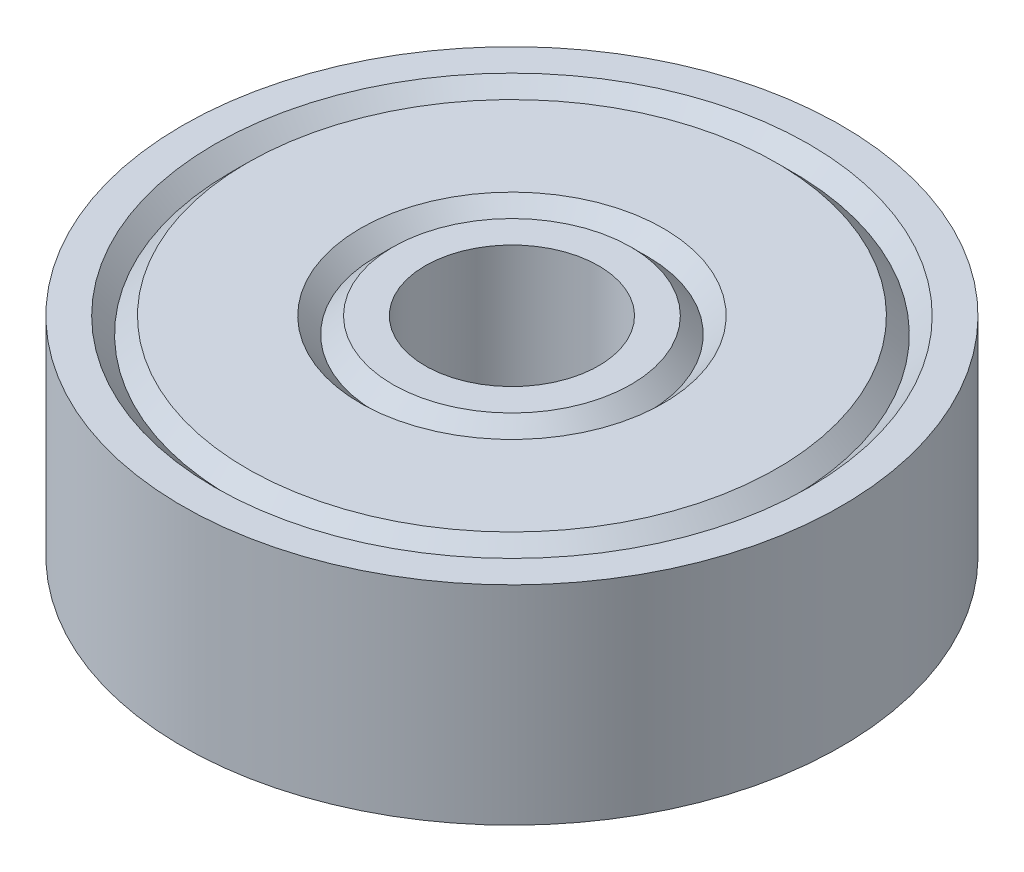
ISO-10303-21;
HEADER;
FILE_DESCRIPTION(('STEP AP214'),'2;1');
FILE_NAME('part.step','',(''),(''),'','','');
FILE_SCHEMA(('AUTOMOTIVE_DESIGN { 1 0 10303 214 1 1 1 1 }'));
ENDSEC;
DATA;
#1=APPLICATION_CONTEXT('core data for automotive mechanical design processes');
#2=APPLICATION_PROTOCOL_DEFINITION('international standard','automotive_design',2000,#1);
#3=PRODUCT_CONTEXT('',#1,'mechanical');
#4=PRODUCT('Part','Part','',(#3));
#5=PRODUCT_RELATED_PRODUCT_CATEGORY('part','',(#4));
#6=PRODUCT_DEFINITION_FORMATION('','',#4);
#7=PRODUCT_DEFINITION_CONTEXT('part definition',#1,'design');
#8=PRODUCT_DEFINITION('design','',#6,#7);
#9=PRODUCT_DEFINITION_SHAPE('','',#8);
#10=(LENGTH_UNIT() NAMED_UNIT(*) SI_UNIT(.MILLI.,.METRE.));
#11=(NAMED_UNIT(*) PLANE_ANGLE_UNIT() SI_UNIT($,.RADIAN.));
#12=(NAMED_UNIT(*) SI_UNIT($,.STERADIAN.) SOLID_ANGLE_UNIT());
#13=UNCERTAINTY_MEASURE_WITH_UNIT(LENGTH_MEASURE(1.E-05),#10,'distance_accuracy_value','');
#14=(GEOMETRIC_REPRESENTATION_CONTEXT(3) GLOBAL_UNCERTAINTY_ASSIGNED_CONTEXT((#13)) GLOBAL_UNIT_ASSIGNED_CONTEXT((#10,
#11,#12)) REPRESENTATION_CONTEXT('',''));
#15=CARTESIAN_POINT('',(0.,0.,0.));
#16=DIRECTION('',(0.,0.,1.));
#17=DIRECTION('',(1.,0.,0.));
#18=AXIS2_PLACEMENT_3D('',#15,#16,#17);
#19=CARTESIAN_POINT('',(0.,3.,0.));
#20=DIRECTION('',(0.,1.,0.));
#21=DIRECTION('',(-1.,0.,0.));
#22=AXIS2_PLACEMENT_3D('',#19,#20,#21);
#23=CYLINDRICAL_SURFACE('',#22,2.5);
#24=CARTESIAN_POINT('',(0.,3.,0.));
#25=DIRECTION('',(0.,1.,0.));
#26=DIRECTION('',(-1.,0.,0.));
#27=AXIS2_PLACEMENT_3D('',#24,#25,#26);
#28=CIRCLE('',#27,2.5);
#29=CARTESIAN_POINT('',(-2.5,3.,0.));
#30=VERTEX_POINT('',#29);
#31=EDGE_CURVE('E83',#30,#30,#28,.T.);
#32=ORIENTED_EDGE('',*,*,#31,.T.);
#33=EDGE_LOOP('',(#32));
#34=FACE_BOUND('',#33,.T.);
#35=CARTESIAN_POINT('',(0.,-3.,0.));
#36=DIRECTION('',(0.,1.,0.));
#37=DIRECTION('',(-1.,0.,0.));
#38=AXIS2_PLACEMENT_3D('',#35,#36,#37);
#39=CIRCLE('',#38,2.5);
#40=CARTESIAN_POINT('',(-2.5,-3.,0.));
#41=VERTEX_POINT('',#40);
#42=EDGE_CURVE('E10',#41,#41,#39,.T.);
#43=ORIENTED_EDGE('',*,*,#42,.F.);
#44=EDGE_LOOP('',(#43));
#45=FACE_BOUND('',#44,.T.);
#46=ADVANCED_FACE('F31',(#34,#45),#23,.F.);
#47=CARTESIAN_POINT('',(-2.5,-3.,0.));
#48=DIRECTION('',(0.,-1.,0.));
#49=DIRECTION('',(1.,0.,0.));
#50=AXIS2_PLACEMENT_3D('',#47,#48,#49);
#51=PLANE('',#50);
#52=ORIENTED_EDGE('',*,*,#42,.T.);
#53=EDGE_LOOP('',(#52));
#54=FACE_BOUND('',#53,.T.);
#55=CARTESIAN_POINT('',(0.,-3.,0.));
#56=DIRECTION('',(0.,1.,0.));
#57=DIRECTION('',(-1.,0.,0.));
#58=AXIS2_PLACEMENT_3D('',#55,#56,#57);
#59=CIRCLE('',#58,3.43333333333333);
#60=CARTESIAN_POINT('',(-3.43333333333333,-3.,0.));
#61=VERTEX_POINT('',#60);
#62=EDGE_CURVE('E37',#61,#61,#59,.T.);
#63=ORIENTED_EDGE('',*,*,#62,.F.);
#64=EDGE_LOOP('',(#63));
#65=FACE_BOUND('',#64,.T.);
#66=ADVANCED_FACE('F101',(#54,#65),#51,.T.);
#67=CARTESIAN_POINT('',(0.,-2.53333333333334,0.));
#68=DIRECTION('',(0.,1.,0.));
#69=DIRECTION('',(-1.,0.,0.));
#70=AXIS2_PLACEMENT_3D('',#67,#68,#69);
#71=CONICAL_SURFACE('',#70,3.89999999999999,0.785398163397451);
#72=ORIENTED_EDGE('',*,*,#62,.T.);
#73=EDGE_LOOP('',(#72));
#74=FACE_BOUND('',#73,.T.);
#75=CARTESIAN_POINT('',(0.,-2.53333333333334,0.));
#76=DIRECTION('',(0.,1.,0.));
#77=DIRECTION('',(-1.,0.,0.));
#78=AXIS2_PLACEMENT_3D('',#75,#76,#77);
#79=CIRCLE('',#78,3.89999999999999);
#80=CARTESIAN_POINT('',(-3.89999999999999,-2.53333333333334,0.));
#81=VERTEX_POINT('',#80);
#82=EDGE_CURVE('E41',#81,#81,#79,.T.);
#83=ORIENTED_EDGE('',*,*,#82,.F.);
#84=EDGE_LOOP('',(#83));
#85=FACE_BOUND('',#84,.T.);
#86=ADVANCED_FACE('F105',(#74,#85),#71,.T.);
#87=CARTESIAN_POINT('',(0.,-3.,0.));
#88=DIRECTION('',(0.,-1.,0.));
#89=DIRECTION('',(1.,0.,0.));
#90=AXIS2_PLACEMENT_3D('',#87,#88,#89);
#91=CONICAL_SURFACE('',#90,4.36666666666666,0.785398163397448);
#92=ORIENTED_EDGE('',*,*,#82,.T.);
#93=EDGE_LOOP('',(#92));
#94=FACE_BOUND('',#93,.T.);
#95=CARTESIAN_POINT('',(0.,-3.,0.));
#96=DIRECTION('',(0.,1.,0.));
#97=DIRECTION('',(-1.,0.,0.));
#98=AXIS2_PLACEMENT_3D('',#95,#96,#97);
#99=CIRCLE('',#98,4.36666666666666);
#100=CARTESIAN_POINT('',(-4.36666666666666,-3.,0.));
#101=VERTEX_POINT('',#100);
#102=EDGE_CURVE('E45',#101,#101,#99,.T.);
#103=ORIENTED_EDGE('',*,*,#102,.F.);
#104=EDGE_LOOP('',(#103));
#105=FACE_BOUND('',#104,.T.);
#106=ADVANCED_FACE('F109',(#94,#105),#91,.F.);
#107=CARTESIAN_POINT('',(-4.36666666666666,-3.,0.));
#108=DIRECTION('',(0.,-1.,0.));
#109=DIRECTION('',(1.,0.,0.));
#110=AXIS2_PLACEMENT_3D('',#107,#108,#109);
#111=PLANE('',#110);
#112=ORIENTED_EDGE('',*,*,#102,.T.);
#113=EDGE_LOOP('',(#112));
#114=FACE_BOUND('',#113,.T.);
#115=CARTESIAN_POINT('',(0.,-3.00000000000001,0.));
#116=DIRECTION('',(0.,1.,0.));
#117=DIRECTION('',(-1.,0.,0.));
#118=AXIS2_PLACEMENT_3D('',#115,#116,#117);
#119=CIRCLE('',#118,7.63333333333333);
#120=CARTESIAN_POINT('',(-7.63333333333333,-3.00000000000001,0.));
#121=VERTEX_POINT('',#120);
#122=EDGE_CURVE('E50',#121,#121,#119,.T.);
#123=ORIENTED_EDGE('',*,*,#122,.F.);
#124=EDGE_LOOP('',(#123));
#125=FACE_BOUND('',#124,.T.);
#126=ADVANCED_FACE('F115',(#114,#125),#111,.T.);
#127=CARTESIAN_POINT('',(0.,-2.53333333333334,0.));
#128=DIRECTION('',(0.,1.,0.));
#129=DIRECTION('',(-1.,0.,0.));
#130=AXIS2_PLACEMENT_3D('',#127,#128,#129);
#131=CONICAL_SURFACE('',#130,8.1,0.785398163397448);
#132=ORIENTED_EDGE('',*,*,#122,.T.);
#133=EDGE_LOOP('',(#132));
#134=FACE_BOUND('',#133,.T.);
#135=CARTESIAN_POINT('',(0.,-2.53333333333334,0.));
#136=DIRECTION('',(0.,1.,0.));
#137=DIRECTION('',(-1.,0.,0.));
#138=AXIS2_PLACEMENT_3D('',#135,#136,#137);
#139=CIRCLE('',#138,8.1);
#140=CARTESIAN_POINT('',(-8.1,-2.53333333333333,0.));
#141=VERTEX_POINT('',#140);
#142=EDGE_CURVE('E53',#141,#141,#139,.T.);
#143=ORIENTED_EDGE('',*,*,#142,.F.);
#144=EDGE_LOOP('',(#143));
#145=FACE_BOUND('',#144,.T.);
#146=ADVANCED_FACE('F119',(#134,#145),#131,.T.);
#147=CARTESIAN_POINT('',(0.,-3.,0.));
#148=DIRECTION('',(0.,-1.,0.));
#149=DIRECTION('',(1.,0.,0.));
#150=AXIS2_PLACEMENT_3D('',#147,#148,#149);
#151=CONICAL_SURFACE('',#150,8.56666666666666,0.785398163397447);
#152=ORIENTED_EDGE('',*,*,#142,.T.);
#153=EDGE_LOOP('',(#152));
#154=FACE_BOUND('',#153,.T.);
#155=CARTESIAN_POINT('',(0.,-3.,0.));
#156=DIRECTION('',(0.,1.,0.));
#157=DIRECTION('',(-1.,0.,0.));
#158=AXIS2_PLACEMENT_3D('',#155,#156,#157);
#159=CIRCLE('',#158,8.56666666666666);
#160=CARTESIAN_POINT('',(-8.56666666666666,-3.,0.));
#161=VERTEX_POINT('',#160);
#162=EDGE_CURVE('E56',#161,#161,#159,.T.);
#163=ORIENTED_EDGE('',*,*,#162,.F.);
#164=EDGE_LOOP('',(#163));
#165=FACE_BOUND('',#164,.T.);
#166=ADVANCED_FACE('F123',(#154,#165),#151,.F.);
#167=CARTESIAN_POINT('',(-8.56666666666666,-3.,0.));
#168=DIRECTION('',(0.,-1.,0.));
#169=DIRECTION('',(1.,0.,0.));
#170=AXIS2_PLACEMENT_3D('',#167,#168,#169);
#171=PLANE('',#170);
#172=ORIENTED_EDGE('',*,*,#162,.T.);
#173=EDGE_LOOP('',(#172));
#174=FACE_BOUND('',#173,.T.);
#175=CARTESIAN_POINT('',(0.,-3.,0.));
#176=DIRECTION('',(0.,1.,0.));
#177=DIRECTION('',(-1.,0.,0.));
#178=AXIS2_PLACEMENT_3D('',#175,#176,#177);
#179=CIRCLE('',#178,9.5);
#180=CARTESIAN_POINT('',(-9.5,-3.,0.));
#181=VERTEX_POINT('',#180);
#182=EDGE_CURVE('E59',#181,#181,#179,.T.);
#183=ORIENTED_EDGE('',*,*,#182,.F.);
#184=EDGE_LOOP('',(#183));
#185=FACE_BOUND('',#184,.T.);
#186=ADVANCED_FACE('F127',(#174,#185),#171,.T.);
#187=CARTESIAN_POINT('',(0.,3.,0.));
#188=DIRECTION('',(0.,1.,0.));
#189=DIRECTION('',(-1.,0.,0.));
#190=AXIS2_PLACEMENT_3D('',#187,#188,#189);
#191=CYLINDRICAL_SURFACE('',#190,9.5);
#192=ORIENTED_EDGE('',*,*,#182,.T.);
#193=EDGE_LOOP('',(#192));
#194=FACE_BOUND('',#193,.T.);
#195=CARTESIAN_POINT('',(0.,3.,0.));
#196=DIRECTION('',(0.,1.,0.));
#197=DIRECTION('',(-1.,0.,0.));
#198=AXIS2_PLACEMENT_3D('',#195,#196,#197);
#199=CIRCLE('',#198,9.49999999999999);
#200=CARTESIAN_POINT('',(-9.49999999999999,3.,0.));
#201=VERTEX_POINT('',#200);
#202=EDGE_CURVE('E62',#201,#201,#199,.T.);
#203=ORIENTED_EDGE('',*,*,#202,.F.);
#204=EDGE_LOOP('',(#203));
#205=FACE_BOUND('',#204,.T.);
#206=ADVANCED_FACE('F131',(#194,#205),#191,.T.);
#207=CARTESIAN_POINT('',(-8.56666666666666,3.,0.));
#208=DIRECTION('',(0.,1.,0.));
#209=DIRECTION('',(-1.,0.,0.));
#210=AXIS2_PLACEMENT_3D('',#207,#208,#209);
#211=PLANE('',#210);
#212=ORIENTED_EDGE('',*,*,#202,.T.);
#213=EDGE_LOOP('',(#212));
#214=FACE_BOUND('',#213,.T.);
#215=CARTESIAN_POINT('',(0.,3.,0.));
#216=DIRECTION('',(0.,1.,0.));
#217=DIRECTION('',(-1.,0.,0.));
#218=AXIS2_PLACEMENT_3D('',#215,#216,#217);
#219=CIRCLE('',#218,8.56666666666666);
#220=CARTESIAN_POINT('',(-8.56666666666666,3.,0.));
#221=VERTEX_POINT('',#220);
#222=EDGE_CURVE('E65',#221,#221,#219,.T.);
#223=ORIENTED_EDGE('',*,*,#222,.F.);
#224=EDGE_LOOP('',(#223));
#225=FACE_BOUND('',#224,.T.);
#226=ADVANCED_FACE('F135',(#214,#225),#211,.T.);
#227=CARTESIAN_POINT('',(0.,2.53333333333333,0.));
#228=DIRECTION('',(0.,1.,0.));
#229=DIRECTION('',(-1.,0.,0.));
#230=AXIS2_PLACEMENT_3D('',#227,#228,#229);
#231=CONICAL_SURFACE('',#230,8.1,0.785398163397446);
#232=ORIENTED_EDGE('',*,*,#222,.T.);
#233=EDGE_LOOP('',(#232));
#234=FACE_BOUND('',#233,.T.);
#235=CARTESIAN_POINT('',(0.,2.53333333333333,0.));
#236=DIRECTION('',(0.,1.,0.));
#237=DIRECTION('',(-1.,0.,0.));
#238=AXIS2_PLACEMENT_3D('',#235,#236,#237);
#239=CIRCLE('',#238,8.1);
#240=CARTESIAN_POINT('',(-8.1,2.53333333333334,0.));
#241=VERTEX_POINT('',#240);
#242=EDGE_CURVE('E68',#241,#241,#239,.T.);
#243=ORIENTED_EDGE('',*,*,#242,.F.);
#244=EDGE_LOOP('',(#243));
#245=FACE_BOUND('',#244,.T.);
#246=ADVANCED_FACE('F139',(#234,#245),#231,.F.);
#247=CARTESIAN_POINT('',(0.,3.00000000000001,0.));
#248=DIRECTION('',(0.,-1.,0.));
#249=DIRECTION('',(1.,0.,0.));
#250=AXIS2_PLACEMENT_3D('',#247,#248,#249);
#251=CONICAL_SURFACE('',#250,7.63333333333333,0.78539816339745);
#252=ORIENTED_EDGE('',*,*,#242,.T.);
#253=EDGE_LOOP('',(#252));
#254=FACE_BOUND('',#253,.T.);
#255=CARTESIAN_POINT('',(0.,3.00000000000001,0.));
#256=DIRECTION('',(0.,1.,0.));
#257=DIRECTION('',(-1.,0.,0.));
#258=AXIS2_PLACEMENT_3D('',#255,#256,#257);
#259=CIRCLE('',#258,7.63333333333333);
#260=CARTESIAN_POINT('',(-7.63333333333333,3.00000000000001,0.));
#261=VERTEX_POINT('',#260);
#262=EDGE_CURVE('E71',#261,#261,#259,.T.);
#263=ORIENTED_EDGE('',*,*,#262,.F.);
#264=EDGE_LOOP('',(#263));
#265=FACE_BOUND('',#264,.T.);
#266=ADVANCED_FACE('F143',(#254,#265),#251,.T.);
#267=CARTESIAN_POINT('',(-4.36666666666666,3.,0.));
#268=DIRECTION('',(0.,1.,0.));
#269=DIRECTION('',(-1.,0.,0.));
#270=AXIS2_PLACEMENT_3D('',#267,#268,#269);
#271=PLANE('',#270);
#272=ORIENTED_EDGE('',*,*,#262,.T.);
#273=EDGE_LOOP('',(#272));
#274=FACE_BOUND('',#273,.T.);
#275=CARTESIAN_POINT('',(0.,3.,0.));
#276=DIRECTION('',(0.,1.,0.));
#277=DIRECTION('',(-1.,0.,0.));
#278=AXIS2_PLACEMENT_3D('',#275,#276,#277);
#279=CIRCLE('',#278,4.36666666666666);
#280=CARTESIAN_POINT('',(-4.36666666666666,3.,0.));
#281=VERTEX_POINT('',#280);
#282=EDGE_CURVE('E74',#281,#281,#279,.T.);
#283=ORIENTED_EDGE('',*,*,#282,.F.);
#284=EDGE_LOOP('',(#283));
#285=FACE_BOUND('',#284,.T.);
#286=ADVANCED_FACE('F147',(#274,#285),#271,.T.);
#287=CARTESIAN_POINT('',(0.,2.53333333333333,0.));
#288=DIRECTION('',(0.,1.,0.));
#289=DIRECTION('',(-1.,0.,0.));
#290=AXIS2_PLACEMENT_3D('',#287,#288,#289);
#291=CONICAL_SURFACE('',#290,3.89999999999999,0.785398163397449);
#292=ORIENTED_EDGE('',*,*,#282,.T.);
#293=EDGE_LOOP('',(#292));
#294=FACE_BOUND('',#293,.T.);
#295=CARTESIAN_POINT('',(0.,2.53333333333333,0.));
#296=DIRECTION('',(0.,1.,0.));
#297=DIRECTION('',(-1.,0.,0.));
#298=AXIS2_PLACEMENT_3D('',#295,#296,#297);
#299=CIRCLE('',#298,3.89999999999999);
#300=CARTESIAN_POINT('',(-3.89999999999999,2.53333333333334,0.));
#301=VERTEX_POINT('',#300);
#302=EDGE_CURVE('E77',#301,#301,#299,.T.);
#303=ORIENTED_EDGE('',*,*,#302,.F.);
#304=EDGE_LOOP('',(#303));
#305=FACE_BOUND('',#304,.T.);
#306=ADVANCED_FACE('F97',(#294,#305),#291,.F.);
#307=CARTESIAN_POINT('',(0.,3.,0.));
#308=DIRECTION('',(0.,-1.,0.));
#309=DIRECTION('',(1.,0.,0.));
#310=AXIS2_PLACEMENT_3D('',#307,#308,#309);
#311=CONICAL_SURFACE('',#310,3.43333333333333,0.785398163397448);
#312=ORIENTED_EDGE('',*,*,#302,.T.);
#313=EDGE_LOOP('',(#312));
#314=FACE_BOUND('',#313,.T.);
#315=CARTESIAN_POINT('',(0.,3.,0.));
#316=DIRECTION('',(0.,1.,0.));
#317=DIRECTION('',(-1.,0.,0.));
#318=AXIS2_PLACEMENT_3D('',#315,#316,#317);
#319=CIRCLE('',#318,3.43333333333333);
#320=CARTESIAN_POINT('',(-3.43333333333333,3.,0.));
#321=VERTEX_POINT('',#320);
#322=EDGE_CURVE('E80',#321,#321,#319,.T.);
#323=ORIENTED_EDGE('',*,*,#322,.F.);
#324=EDGE_LOOP('',(#323));
#325=FACE_BOUND('',#324,.T.);
#326=ADVANCED_FACE('F91',(#314,#325),#311,.T.);
#327=CARTESIAN_POINT('',(-2.5,3.,0.));
#328=DIRECTION('',(0.,1.,0.));
#329=DIRECTION('',(-1.,0.,0.));
#330=AXIS2_PLACEMENT_3D('',#327,#328,#329);
#331=PLANE('',#330);
#332=ORIENTED_EDGE('',*,*,#322,.T.);
#333=EDGE_LOOP('',(#332));
#334=FACE_BOUND('',#333,.T.);
#335=ORIENTED_EDGE('',*,*,#31,.F.);
#336=EDGE_LOOP('',(#335));
#337=FACE_BOUND('',#336,.T.);
#338=ADVANCED_FACE('F89',(#334,#337),#331,.T.);
#339=CLOSED_SHELL('',(#46,#66,#86,#106,#126,#146,#166,#186,#206,#226,#246,#266,#286,#306,#326,#338));
#340=MANIFOLD_SOLID_BREP('B2',#339);
#341=ADVANCED_BREP_SHAPE_REPRESENTATION('',(#18,#340),#14);
#342=SHAPE_DEFINITION_REPRESENTATION(#9,#341);
ENDSEC;
END-ISO-10303-21;
